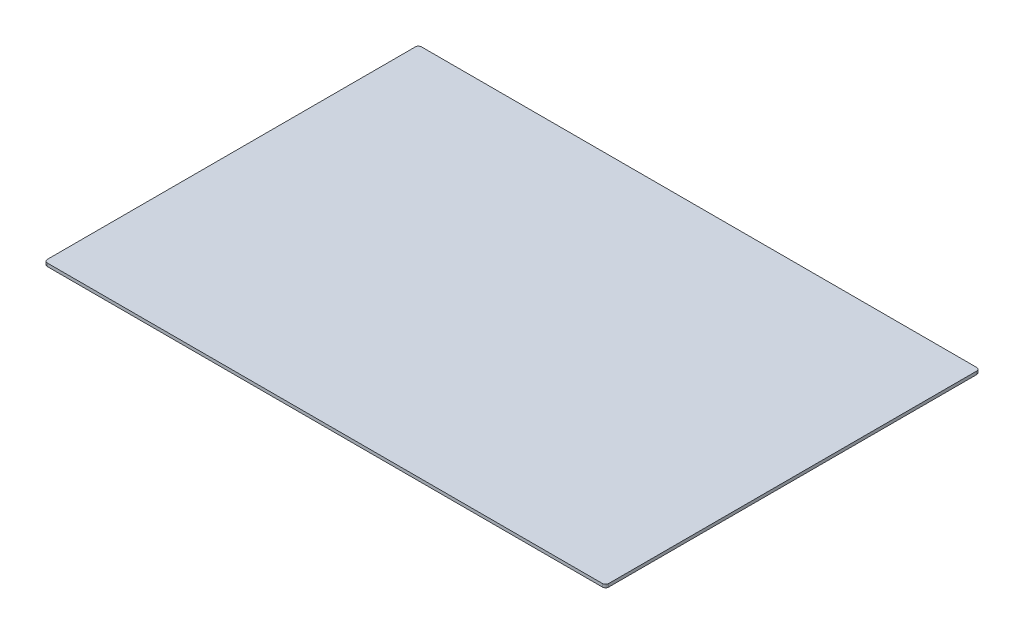
ISO-10303-21;
HEADER;
FILE_DESCRIPTION(('STEP AP214'),'2;1');
FILE_NAME('part.step','',(''),(''),'','','');
FILE_SCHEMA(('AUTOMOTIVE_DESIGN { 1 0 10303 214 1 1 1 1 }'));
ENDSEC;
DATA;
#1=APPLICATION_CONTEXT('core data for automotive mechanical design processes');
#2=APPLICATION_PROTOCOL_DEFINITION('international standard','automotive_design',2000,#1);
#3=PRODUCT_CONTEXT('',#1,'mechanical');
#4=PRODUCT('Part','Part','',(#3));
#5=PRODUCT_RELATED_PRODUCT_CATEGORY('part','',(#4));
#6=PRODUCT_DEFINITION_FORMATION('','',#4);
#7=PRODUCT_DEFINITION_CONTEXT('part definition',#1,'design');
#8=PRODUCT_DEFINITION('design','',#6,#7);
#9=PRODUCT_DEFINITION_SHAPE('','',#8);
#10=(LENGTH_UNIT() NAMED_UNIT(*) SI_UNIT(.MILLI.,.METRE.));
#11=(NAMED_UNIT(*) PLANE_ANGLE_UNIT() SI_UNIT($,.RADIAN.));
#12=(NAMED_UNIT(*) SI_UNIT($,.STERADIAN.) SOLID_ANGLE_UNIT());
#13=UNCERTAINTY_MEASURE_WITH_UNIT(LENGTH_MEASURE(1.E-05),#10,'distance_accuracy_value','');
#14=(GEOMETRIC_REPRESENTATION_CONTEXT(3) GLOBAL_UNCERTAINTY_ASSIGNED_CONTEXT((#13)) GLOBAL_UNIT_ASSIGNED_CONTEXT((#10,
#11,#12)) REPRESENTATION_CONTEXT('',''));
#15=CARTESIAN_POINT('',(0.,0.,0.));
#16=DIRECTION('',(0.,0.,1.));
#17=DIRECTION('',(1.,0.,0.));
#18=AXIS2_PLACEMENT_3D('',#15,#16,#17);
#19=CARTESIAN_POINT('',(450.,5.,-325.));
#20=DIRECTION('',(-1.,0.,0.));
#21=DIRECTION('',(0.,0.,1.));
#22=AXIS2_PLACEMENT_3D('',#19,#20,#21);
#23=PLANE('',#22);
#24=DIRECTION('',(0.,0.,-1.));
#25=VECTOR('',#24,1.);
#26=CARTESIAN_POINT('',(450.,0.,-325.));
#27=LINE('',#26,#25);
#28=CARTESIAN_POINT('',(450.,0.,270.));
#29=VERTEX_POINT('',#28);
#30=CARTESIAN_POINT('',(450.,0.,-320.));
#31=VERTEX_POINT('',#30);
#32=EDGE_CURVE('E135',#29,#31,#27,.T.);
#33=ORIENTED_EDGE('',*,*,#32,.T.);
#34=DIRECTION('',(0.,-1.,0.));
#35=VECTOR('',#34,1.);
#36=CARTESIAN_POINT('',(450.,5.,-320.));
#37=LINE('',#36,#35);
#38=CARTESIAN_POINT('',(450.,5.,-320.));
#39=VERTEX_POINT('',#38);
#40=EDGE_CURVE('E11',#31,#39,#37,.F.);
#41=ORIENTED_EDGE('',*,*,#40,.T.);
#42=DIRECTION('',(0.,0.,-1.));
#43=VECTOR('',#42,1.);
#44=CARTESIAN_POINT('',(450.,5.,-325.));
#45=LINE('',#44,#43);
#46=CARTESIAN_POINT('',(450.,5.,270.));
#47=VERTEX_POINT('',#46);
#48=EDGE_CURVE('E133',#47,#39,#45,.T.);
#49=ORIENTED_EDGE('',*,*,#48,.F.);
#50=DIRECTION('',(0.,-1.,0.));
#51=VECTOR('',#50,1.);
#52=CARTESIAN_POINT('',(450.,5.,270.));
#53=LINE('',#52,#51);
#54=EDGE_CURVE('E47',#47,#29,#53,.T.);
#55=ORIENTED_EDGE('',*,*,#54,.T.);
#56=EDGE_LOOP('',(#33,#41,#49,#55));
#57=FACE_BOUND('',#56,.T.);
#58=ADVANCED_FACE('F39',(#57),#23,.F.);
#59=CARTESIAN_POINT('',(-450.,5.,-325.));
#60=DIRECTION('',(0.,0.,1.));
#61=DIRECTION('',(1.,0.,0.));
#62=AXIS2_PLACEMENT_3D('',#59,#60,#61);
#63=PLANE('',#62);
#64=DIRECTION('',(-1.,0.,0.));
#65=VECTOR('',#64,1.);
#66=CARTESIAN_POINT('',(-450.,0.,-325.));
#67=LINE('',#66,#65);
#68=CARTESIAN_POINT('',(445.,0.,-325.));
#69=VERTEX_POINT('',#68);
#70=CARTESIAN_POINT('',(-445.,0.,-325.));
#71=VERTEX_POINT('',#70);
#72=EDGE_CURVE('E131',#69,#71,#67,.T.);
#73=ORIENTED_EDGE('',*,*,#72,.T.);
#74=DIRECTION('',(0.,-1.,0.));
#75=VECTOR('',#74,1.);
#76=CARTESIAN_POINT('',(-445.,5.,-325.));
#77=LINE('',#76,#75);
#78=CARTESIAN_POINT('',(-445.,5.,-325.));
#79=VERTEX_POINT('',#78);
#80=EDGE_CURVE('E110',#71,#79,#77,.F.);
#81=ORIENTED_EDGE('',*,*,#80,.T.);
#82=DIRECTION('',(-1.,0.,0.));
#83=VECTOR('',#82,1.);
#84=CARTESIAN_POINT('',(-450.,5.,-325.));
#85=LINE('',#84,#83);
#86=CARTESIAN_POINT('',(445.,5.,-325.));
#87=VERTEX_POINT('',#86);
#88=EDGE_CURVE('E171',#87,#79,#85,.T.);
#89=ORIENTED_EDGE('',*,*,#88,.F.);
#90=DIRECTION('',(0.,-1.,0.));
#91=VECTOR('',#90,1.);
#92=CARTESIAN_POINT('',(445.,5.,-325.));
#93=LINE('',#92,#91);
#94=EDGE_CURVE('E115',#87,#69,#93,.T.);
#95=ORIENTED_EDGE('',*,*,#94,.T.);
#96=EDGE_LOOP('',(#73,#81,#89,#95));
#97=FACE_BOUND('',#96,.T.);
#98=ADVANCED_FACE('F181',(#97),#63,.F.);
#99=CARTESIAN_POINT('',(-450.,5.,-325.));
#100=DIRECTION('',(1.,0.,0.));
#101=DIRECTION('',(0.,0.,-1.));
#102=AXIS2_PLACEMENT_3D('',#99,#100,#101);
#103=PLANE('',#102);
#104=DIRECTION('',(0.,0.,1.));
#105=VECTOR('',#104,1.);
#106=CARTESIAN_POINT('',(-450.,5.,-325.));
#107=LINE('',#106,#105);
#108=CARTESIAN_POINT('',(-450.,5.,-320.));
#109=VERTEX_POINT('',#108);
#110=CARTESIAN_POINT('',(-450.,5.,270.));
#111=VERTEX_POINT('',#110);
#112=EDGE_CURVE('E124',#109,#111,#107,.T.);
#113=ORIENTED_EDGE('',*,*,#112,.F.);
#114=DIRECTION('',(0.,-1.,0.));
#115=VECTOR('',#114,1.);
#116=CARTESIAN_POINT('',(-450.,5.,-320.));
#117=LINE('',#116,#115);
#118=CARTESIAN_POINT('',(-450.,0.,-320.));
#119=VERTEX_POINT('',#118);
#120=EDGE_CURVE('E109',#109,#119,#117,.T.);
#121=ORIENTED_EDGE('',*,*,#120,.T.);
#122=DIRECTION('',(0.,0.,1.));
#123=VECTOR('',#122,1.);
#124=CARTESIAN_POINT('',(-450.,0.,-325.));
#125=LINE('',#124,#123);
#126=CARTESIAN_POINT('',(-450.,0.,270.));
#127=VERTEX_POINT('',#126);
#128=EDGE_CURVE('E122',#119,#127,#125,.T.);
#129=ORIENTED_EDGE('',*,*,#128,.T.);
#130=DIRECTION('',(0.,-1.,0.));
#131=VECTOR('',#130,1.);
#132=CARTESIAN_POINT('',(-450.,5.,270.));
#133=LINE('',#132,#131);
#134=EDGE_CURVE('E126',#127,#111,#133,.F.);
#135=ORIENTED_EDGE('',*,*,#134,.T.);
#136=EDGE_LOOP('',(#113,#121,#129,#135));
#137=FACE_BOUND('',#136,.T.);
#138=ADVANCED_FACE('F121',(#137),#103,.F.);
#139=CARTESIAN_POINT('',(-450.,5.,275.));
#140=DIRECTION('',(0.,0.,-1.));
#141=DIRECTION('',(-1.,0.,0.));
#142=AXIS2_PLACEMENT_3D('',#139,#140,#141);
#143=PLANE('',#142);
#144=DIRECTION('',(1.,0.,0.));
#145=VECTOR('',#144,1.);
#146=CARTESIAN_POINT('',(-450.,5.,275.));
#147=LINE('',#146,#145);
#148=CARTESIAN_POINT('',(-445.,5.,275.));
#149=VERTEX_POINT('',#148);
#150=CARTESIAN_POINT('',(445.,5.,275.));
#151=VERTEX_POINT('',#150);
#152=EDGE_CURVE('E139',#149,#151,#147,.T.);
#153=ORIENTED_EDGE('',*,*,#152,.F.);
#154=DIRECTION('',(0.,-1.,0.));
#155=VECTOR('',#154,1.);
#156=CARTESIAN_POINT('',(-445.,5.,275.));
#157=LINE('',#156,#155);
#158=CARTESIAN_POINT('',(-445.,0.,275.));
#159=VERTEX_POINT('',#158);
#160=EDGE_CURVE('E156',#149,#159,#157,.T.);
#161=ORIENTED_EDGE('',*,*,#160,.T.);
#162=DIRECTION('',(1.,0.,0.));
#163=VECTOR('',#162,1.);
#164=CARTESIAN_POINT('',(-450.,0.,275.));
#165=LINE('',#164,#163);
#166=CARTESIAN_POINT('',(445.,0.,275.));
#167=VERTEX_POINT('',#166);
#168=EDGE_CURVE('E130',#159,#167,#165,.T.);
#169=ORIENTED_EDGE('',*,*,#168,.T.);
#170=DIRECTION('',(0.,-1.,0.));
#171=VECTOR('',#170,1.);
#172=CARTESIAN_POINT('',(445.,5.,275.));
#173=LINE('',#172,#171);
#174=EDGE_CURVE('E54',#167,#151,#173,.F.);
#175=ORIENTED_EDGE('',*,*,#174,.T.);
#176=EDGE_LOOP('',(#153,#161,#169,#175));
#177=FACE_BOUND('',#176,.T.);
#178=ADVANCED_FACE('F185',(#177),#143,.F.);
#179=CARTESIAN_POINT('',(0.,5.,0.));
#180=DIRECTION('',(0.,1.,0.));
#181=DIRECTION('',(0.,0.,1.));
#182=AXIS2_PLACEMENT_3D('',#179,#180,#181);
#183=PLANE('',#182);
#184=ORIENTED_EDGE('',*,*,#88,.T.);
#185=CARTESIAN_POINT('',(-445.,5.,-320.));
#186=DIRECTION('',(0.,1.,0.));
#187=DIRECTION('',(0.,0.,1.));
#188=AXIS2_PLACEMENT_3D('',#185,#186,#187);
#189=CIRCLE('',#188,5.);
#190=EDGE_CURVE('E153',#79,#109,#189,.T.);
#191=ORIENTED_EDGE('',*,*,#190,.T.);
#192=ORIENTED_EDGE('',*,*,#112,.T.);
#193=CARTESIAN_POINT('',(-445.,5.,270.));
#194=DIRECTION('',(0.,1.,0.));
#195=DIRECTION('',(0.,0.,1.));
#196=AXIS2_PLACEMENT_3D('',#193,#194,#195);
#197=CIRCLE('',#196,5.);
#198=EDGE_CURVE('E61',#111,#149,#197,.T.);
#199=ORIENTED_EDGE('',*,*,#198,.T.);
#200=ORIENTED_EDGE('',*,*,#152,.T.);
#201=CARTESIAN_POINT('',(445.,5.,270.));
#202=DIRECTION('',(0.,1.,0.));
#203=DIRECTION('',(0.,0.,1.));
#204=AXIS2_PLACEMENT_3D('',#201,#202,#203);
#205=CIRCLE('',#204,5.);
#206=EDGE_CURVE('E148',#151,#47,#205,.T.);
#207=ORIENTED_EDGE('',*,*,#206,.T.);
#208=ORIENTED_EDGE('',*,*,#48,.T.);
#209=CARTESIAN_POINT('',(445.,5.,-320.));
#210=DIRECTION('',(0.,1.,0.));
#211=DIRECTION('',(0.,0.,1.));
#212=AXIS2_PLACEMENT_3D('',#209,#210,#211);
#213=CIRCLE('',#212,5.);
#214=EDGE_CURVE('E150',#39,#87,#213,.T.);
#215=ORIENTED_EDGE('',*,*,#214,.T.);
#216=EDGE_LOOP('',(#184,#191,#192,#199,#200,#207,#208,#215));
#217=FACE_BOUND('',#216,.T.);
#218=ADVANCED_FACE('F175',(#217),#183,.T.);
#219=CARTESIAN_POINT('',(0.,0.,0.));
#220=DIRECTION('',(0.,1.,0.));
#221=DIRECTION('',(0.,0.,1.));
#222=AXIS2_PLACEMENT_3D('',#219,#220,#221);
#223=PLANE('',#222);
#224=ORIENTED_EDGE('',*,*,#128,.F.);
#225=CARTESIAN_POINT('',(-445.,0.,-320.));
#226=DIRECTION('',(0.,1.,0.));
#227=DIRECTION('',(0.,0.,1.));
#228=AXIS2_PLACEMENT_3D('',#225,#226,#227);
#229=CIRCLE('',#228,5.);
#230=EDGE_CURVE('E105',#119,#71,#229,.F.);
#231=ORIENTED_EDGE('',*,*,#230,.T.);
#232=ORIENTED_EDGE('',*,*,#72,.F.);
#233=CARTESIAN_POINT('',(445.,0.,-320.));
#234=DIRECTION('',(0.,1.,0.));
#235=DIRECTION('',(0.,0.,1.));
#236=AXIS2_PLACEMENT_3D('',#233,#234,#235);
#237=CIRCLE('',#236,5.);
#238=EDGE_CURVE('E142',#69,#31,#237,.F.);
#239=ORIENTED_EDGE('',*,*,#238,.T.);
#240=ORIENTED_EDGE('',*,*,#32,.F.);
#241=CARTESIAN_POINT('',(445.,0.,270.));
#242=DIRECTION('',(0.,1.,0.));
#243=DIRECTION('',(0.,0.,1.));
#244=AXIS2_PLACEMENT_3D('',#241,#242,#243);
#245=CIRCLE('',#244,5.);
#246=EDGE_CURVE('E125',#29,#167,#245,.F.);
#247=ORIENTED_EDGE('',*,*,#246,.T.);
#248=ORIENTED_EDGE('',*,*,#168,.F.);
#249=CARTESIAN_POINT('',(-445.,0.,270.));
#250=DIRECTION('',(0.,1.,0.));
#251=DIRECTION('',(0.,0.,1.));
#252=AXIS2_PLACEMENT_3D('',#249,#250,#251);
#253=CIRCLE('',#252,5.);
#254=EDGE_CURVE('E116',#159,#127,#253,.F.);
#255=ORIENTED_EDGE('',*,*,#254,.T.);
#256=EDGE_LOOP('',(#224,#231,#232,#239,#240,#247,#248,#255));
#257=FACE_BOUND('',#256,.T.);
#258=ADVANCED_FACE('F128',(#257),#223,.F.);
#259=CARTESIAN_POINT('',(-445.,5.,-320.));
#260=DIRECTION('',(0.,-1.,0.));
#261=DIRECTION('',(0.,0.,-1.));
#262=AXIS2_PLACEMENT_3D('',#259,#260,#261);
#263=CYLINDRICAL_SURFACE('',#262,5.);
#264=ORIENTED_EDGE('',*,*,#190,.F.);
#265=ORIENTED_EDGE('',*,*,#80,.F.);
#266=ORIENTED_EDGE('',*,*,#230,.F.);
#267=ORIENTED_EDGE('',*,*,#120,.F.);
#268=EDGE_LOOP('',(#264,#265,#266,#267));
#269=FACE_BOUND('',#268,.T.);
#270=ADVANCED_FACE('F108',(#269),#263,.T.);
#271=CARTESIAN_POINT('',(-445.,5.,270.));
#272=DIRECTION('',(0.,-1.,0.));
#273=DIRECTION('',(0.,0.,-1.));
#274=AXIS2_PLACEMENT_3D('',#271,#272,#273);
#275=CYLINDRICAL_SURFACE('',#274,5.);
#276=ORIENTED_EDGE('',*,*,#198,.F.);
#277=ORIENTED_EDGE('',*,*,#134,.F.);
#278=ORIENTED_EDGE('',*,*,#254,.F.);
#279=ORIENTED_EDGE('',*,*,#160,.F.);
#280=EDGE_LOOP('',(#276,#277,#278,#279));
#281=FACE_BOUND('',#280,.T.);
#282=ADVANCED_FACE('F184',(#281),#275,.T.);
#283=CARTESIAN_POINT('',(445.,5.,-320.));
#284=DIRECTION('',(0.,-1.,0.));
#285=DIRECTION('',(0.,0.,-1.));
#286=AXIS2_PLACEMENT_3D('',#283,#284,#285);
#287=CYLINDRICAL_SURFACE('',#286,5.);
#288=ORIENTED_EDGE('',*,*,#214,.F.);
#289=ORIENTED_EDGE('',*,*,#40,.F.);
#290=ORIENTED_EDGE('',*,*,#238,.F.);
#291=ORIENTED_EDGE('',*,*,#94,.F.);
#292=EDGE_LOOP('',(#288,#289,#290,#291));
#293=FACE_BOUND('',#292,.T.);
#294=ADVANCED_FACE('F179',(#293),#287,.T.);
#295=CARTESIAN_POINT('',(445.,5.,270.));
#296=DIRECTION('',(0.,-1.,0.));
#297=DIRECTION('',(0.,0.,-1.));
#298=AXIS2_PLACEMENT_3D('',#295,#296,#297);
#299=CYLINDRICAL_SURFACE('',#298,5.);
#300=ORIENTED_EDGE('',*,*,#206,.F.);
#301=ORIENTED_EDGE('',*,*,#174,.F.);
#302=ORIENTED_EDGE('',*,*,#246,.F.);
#303=ORIENTED_EDGE('',*,*,#54,.F.);
#304=EDGE_LOOP('',(#300,#301,#302,#303));
#305=FACE_BOUND('',#304,.T.);
#306=ADVANCED_FACE('F41',(#305),#299,.T.);
#307=CLOSED_SHELL('',(#58,#98,#138,#178,#218,#258,#270,#282,#294,#306));
#308=MANIFOLD_SOLID_BREP('B2',#307);
#309=ADVANCED_BREP_SHAPE_REPRESENTATION('',(#18,#308),#14);
#310=SHAPE_DEFINITION_REPRESENTATION(#9,#309);
ENDSEC;
END-ISO-10303-21;
